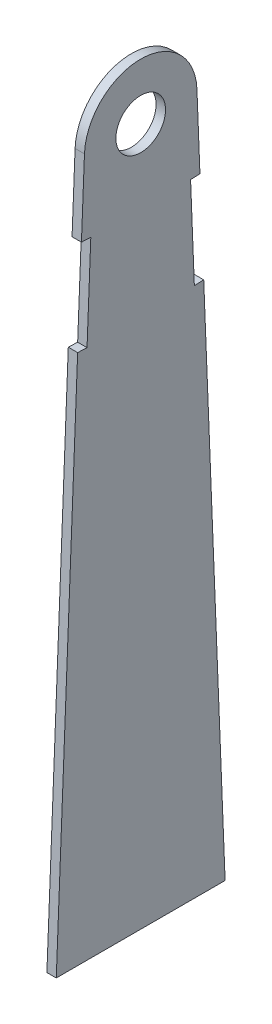
ISO-10303-21;
HEADER;
FILE_DESCRIPTION(('STEP AP214'),'2;1');
FILE_NAME('part.step','',(''),(''),'','','');
FILE_SCHEMA(('AUTOMOTIVE_DESIGN { 1 0 10303 214 1 1 1 1 }'));
ENDSEC;
DATA;
#1=APPLICATION_CONTEXT('core data for automotive mechanical design processes');
#2=APPLICATION_PROTOCOL_DEFINITION('international standard','automotive_design',2000,#1);
#3=PRODUCT_CONTEXT('',#1,'mechanical');
#4=PRODUCT('Part','Part','',(#3));
#5=PRODUCT_RELATED_PRODUCT_CATEGORY('part','',(#4));
#6=PRODUCT_DEFINITION_FORMATION('','',#4);
#7=PRODUCT_DEFINITION_CONTEXT('part definition',#1,'design');
#8=PRODUCT_DEFINITION('design','',#6,#7);
#9=PRODUCT_DEFINITION_SHAPE('','',#8);
#10=(LENGTH_UNIT() NAMED_UNIT(*) SI_UNIT(.MILLI.,.METRE.));
#11=(NAMED_UNIT(*) PLANE_ANGLE_UNIT() SI_UNIT($,.RADIAN.));
#12=(NAMED_UNIT(*) SI_UNIT($,.STERADIAN.) SOLID_ANGLE_UNIT());
#13=UNCERTAINTY_MEASURE_WITH_UNIT(LENGTH_MEASURE(1.E-05),#10,'distance_accuracy_value','');
#14=(GEOMETRIC_REPRESENTATION_CONTEXT(3) GLOBAL_UNCERTAINTY_ASSIGNED_CONTEXT((#13)) GLOBAL_UNIT_ASSIGNED_CONTEXT((#10,
#11,#12)) REPRESENTATION_CONTEXT('',''));
#15=CARTESIAN_POINT('',(0.,0.,0.));
#16=DIRECTION('',(0.,0.,1.));
#17=DIRECTION('',(1.,0.,0.));
#18=AXIS2_PLACEMENT_3D('',#15,#16,#17);
#19=CARTESIAN_POINT('',(1.5875,0.38341424361724,-9.51727999576515));
#20=DIRECTION('',(0.,-0.0402534638968231,0.999189500867732));
#21=DIRECTION('',(0.,-0.999189500867732,-0.0402534638968231));
#22=AXIS2_PLACEMENT_3D('',#19,#20,#21);
#23=PLANE('',#22);
#24=DIRECTION('',(0.,0.999189500867732,0.0402534638968231));
#25=VECTOR('',#24,1.);
#26=CARTESIAN_POINT('',(0.,0.38341424361724,-9.51727999576515));
#27=LINE('',#26,#25);
#28=CARTESIAN_POINT('',(0.,-12.306292417403,-10.0284989872548));
#29=VERTEX_POINT('',#28);
#30=CARTESIAN_POINT('',(0.,0.38341424361724,-9.51727999576515));
#31=VERTEX_POINT('',#30);
#32=EDGE_CURVE('E157',#29,#31,#27,.T.);
#33=ORIENTED_EDGE('',*,*,#32,.T.);
#34=DIRECTION('',(-1.,0.,0.));
#35=VECTOR('',#34,1.);
#36=CARTESIAN_POINT('',(1.5875,0.38341424361724,-9.51727999576515));
#37=LINE('',#36,#35);
#38=CARTESIAN_POINT('',(1.5875,0.38341424361724,-9.51727999576515));
#39=VERTEX_POINT('',#38);
#40=EDGE_CURVE('E11',#39,#31,#37,.T.);
#41=ORIENTED_EDGE('',*,*,#40,.F.);
#42=DIRECTION('',(0.,0.999189500867732,0.0402534638968231));
#43=VECTOR('',#42,1.);
#44=CARTESIAN_POINT('',(1.5875,0.38341424361724,-9.51727999576515));
#45=LINE('',#44,#43);
#46=CARTESIAN_POINT('',(1.5875,-12.306292417403,-10.0284989872548));
#47=VERTEX_POINT('',#46);
#48=EDGE_CURVE('E186',#47,#39,#45,.T.);
#49=ORIENTED_EDGE('',*,*,#48,.F.);
#50=DIRECTION('',(-1.,0.,0.));
#51=VECTOR('',#50,1.);
#52=CARTESIAN_POINT('',(1.5875,-12.306292417403,-10.0284989872548));
#53=LINE('',#52,#51);
#54=EDGE_CURVE('E51',#47,#29,#53,.T.);
#55=ORIENTED_EDGE('',*,*,#54,.T.);
#56=EDGE_LOOP('',(#33,#41,#49,#55));
#57=FACE_BOUND('',#56,.T.);
#58=ADVANCED_FACE('F34',(#57),#23,.F.);
#59=CARTESIAN_POINT('',(1.5875,0.,0.));
#60=DIRECTION('',(-1.,0.,0.));
#61=DIRECTION('',(0.,0.,1.));
#62=AXIS2_PLACEMENT_3D('',#59,#60,#61);
#63=CYLINDRICAL_SURFACE('',#62,9.525);
#64=CARTESIAN_POINT('',(0.,0.,0.));
#65=DIRECTION('',(1.,0.,0.));
#66=DIRECTION('',(0.,0.,-1.));
#67=AXIS2_PLACEMENT_3D('',#64,#65,#66);
#68=CIRCLE('',#67,9.525);
#69=CARTESIAN_POINT('',(0.,0.383414243617209,9.51727999576515));
#70=VERTEX_POINT('',#69);
#71=EDGE_CURVE('E159',#31,#70,#68,.T.);
#72=ORIENTED_EDGE('',*,*,#71,.T.);
#73=DIRECTION('',(-1.,0.,0.));
#74=VECTOR('',#73,1.);
#75=CARTESIAN_POINT('',(1.5875,0.383414243617209,9.51727999576515));
#76=LINE('',#75,#74);
#77=CARTESIAN_POINT('',(1.5875,0.383414243617209,9.51727999576515));
#78=VERTEX_POINT('',#77);
#79=EDGE_CURVE('E43',#78,#70,#76,.T.);
#80=ORIENTED_EDGE('',*,*,#79,.F.);
#81=CARTESIAN_POINT('',(1.5875,0.,0.));
#82=DIRECTION('',(1.,0.,0.));
#83=DIRECTION('',(0.,0.,-1.));
#84=AXIS2_PLACEMENT_3D('',#81,#82,#83);
#85=CIRCLE('',#84,9.525);
#86=EDGE_CURVE('E102',#39,#78,#85,.T.);
#87=ORIENTED_EDGE('',*,*,#86,.F.);
#88=ORIENTED_EDGE('',*,*,#40,.T.);
#89=EDGE_LOOP('',(#72,#80,#87,#88));
#90=FACE_BOUND('',#89,.T.);
#91=ADVANCED_FACE('F36',(#90),#63,.T.);
#92=CARTESIAN_POINT('',(1.5875,0.383414243617209,9.51727999576515));
#93=DIRECTION('',(0.,0.0402534638968198,0.999189500867732));
#94=DIRECTION('',(0.,-0.999189500867732,0.0402534638968198));
#95=AXIS2_PLACEMENT_3D('',#92,#93,#94);
#96=PLANE('',#95);
#97=DIRECTION('',(0.,0.999189500867732,-0.0402534638968198));
#98=VECTOR('',#97,1.);
#99=CARTESIAN_POINT('',(0.,0.383414243617209,9.51727999576515));
#100=LINE('',#99,#98);
#101=CARTESIAN_POINT('',(0.,-12.306292417403,10.0284989872548));
#102=VERTEX_POINT('',#101);
#103=EDGE_CURVE('E164',#102,#70,#100,.T.);
#104=ORIENTED_EDGE('',*,*,#103,.F.);
#105=DIRECTION('',(-1.,0.,0.));
#106=VECTOR('',#105,1.);
#107=CARTESIAN_POINT('',(1.5875,-12.306292417403,10.0284989872548));
#108=LINE('',#107,#106);
#109=CARTESIAN_POINT('',(1.5875,-12.306292417403,10.0284989872548));
#110=VERTEX_POINT('',#109);
#111=EDGE_CURVE('E200',#110,#102,#108,.T.);
#112=ORIENTED_EDGE('',*,*,#111,.F.);
#113=DIRECTION('',(0.,0.999189500867732,-0.0402534638968198));
#114=VECTOR('',#113,1.);
#115=CARTESIAN_POINT('',(1.5875,0.383414243617209,9.51727999576515));
#116=LINE('',#115,#114);
#117=EDGE_CURVE('E206',#110,#78,#116,.T.);
#118=ORIENTED_EDGE('',*,*,#117,.T.);
#119=ORIENTED_EDGE('',*,*,#79,.T.);
#120=EDGE_LOOP('',(#104,#112,#118,#119));
#121=FACE_BOUND('',#120,.T.);
#122=ADVANCED_FACE('F204',(#121),#96,.T.);
#123=CARTESIAN_POINT('',(1.5875,-12.6897066610202,0.511218991489607));
#124=DIRECTION('',(0.,0.999189500867732,-0.0402534638968195));
#125=DIRECTION('',(0.,0.0402534638968195,0.999189500867732));
#126=AXIS2_PLACEMENT_3D('',#123,#124,#125);
#127=PLANE('',#126);
#128=DIRECTION('',(0.,-0.0402534638968195,-0.999189500867732));
#129=VECTOR('',#128,1.);
#130=CARTESIAN_POINT('',(0.,-12.6897066610202,0.511218991489607));
#131=LINE('',#130,#129);
#132=CARTESIAN_POINT('',(0.,-12.3701947913392,8.44228565462724));
#133=VERTEX_POINT('',#132);
#134=EDGE_CURVE('E167',#102,#133,#131,.T.);
#135=ORIENTED_EDGE('',*,*,#134,.T.);
#136=DIRECTION('',(-1.,0.,0.));
#137=VECTOR('',#136,1.);
#138=CARTESIAN_POINT('',(1.5875,-12.3701947913392,8.44228565462724));
#139=LINE('',#138,#137);
#140=CARTESIAN_POINT('',(1.5875,-12.3701947913392,8.44228565462724));
#141=VERTEX_POINT('',#140);
#142=EDGE_CURVE('E198',#141,#133,#139,.T.);
#143=ORIENTED_EDGE('',*,*,#142,.F.);
#144=DIRECTION('',(0.,-0.0402534638968195,-0.999189500867732));
#145=VECTOR('',#144,1.);
#146=CARTESIAN_POINT('',(1.5875,-12.6897066610202,0.511218991489607));
#147=LINE('',#146,#145);
#148=EDGE_CURVE('E217',#110,#141,#147,.T.);
#149=ORIENTED_EDGE('',*,*,#148,.F.);
#150=ORIENTED_EDGE('',*,*,#111,.T.);
#151=EDGE_LOOP('',(#135,#143,#149,#150));
#152=FACE_BOUND('',#151,.T.);
#153=ADVANCED_FACE('F214',(#152),#127,.F.);
#154=CARTESIAN_POINT('',(1.5875,0.319511869681007,7.93106666313763));
#155=DIRECTION('',(0.,0.0402534638968198,0.999189500867732));
#156=DIRECTION('',(0.,-0.999189500867732,0.0402534638968198));
#157=AXIS2_PLACEMENT_3D('',#154,#155,#156);
#158=PLANE('',#157);
#159=DIRECTION('',(0.,0.999189500867732,-0.0402534638968198));
#160=VECTOR('',#159,1.);
#161=CARTESIAN_POINT('',(0.,0.319511869681007,7.93106666313763));
#162=LINE('',#161,#160);
#163=CARTESIAN_POINT('',(0.,-28.2323281176144,9.08130939398925));
#164=VERTEX_POINT('',#163);
#165=EDGE_CURVE('E171',#164,#133,#162,.T.);
#166=ORIENTED_EDGE('',*,*,#165,.F.);
#167=DIRECTION('',(-1.,0.,0.));
#168=VECTOR('',#167,1.);
#169=CARTESIAN_POINT('',(1.5875,-28.2323281176144,9.08130939398925));
#170=LINE('',#169,#168);
#171=CARTESIAN_POINT('',(1.5875,-28.2323281176144,9.08130939398925));
#172=VERTEX_POINT('',#171);
#173=EDGE_CURVE('E196',#172,#164,#170,.T.);
#174=ORIENTED_EDGE('',*,*,#173,.F.);
#175=DIRECTION('',(0.,0.999189500867732,-0.0402534638968198));
#176=VECTOR('',#175,1.);
#177=CARTESIAN_POINT('',(1.5875,0.319511869681007,7.93106666313763));
#178=LINE('',#177,#176);
#179=EDGE_CURVE('E219',#172,#141,#178,.T.);
#180=ORIENTED_EDGE('',*,*,#179,.T.);
#181=ORIENTED_EDGE('',*,*,#142,.T.);
#182=EDGE_LOOP('',(#166,#174,#180,#181));
#183=FACE_BOUND('',#182,.T.);
#184=ADVANCED_FACE('F236',(#183),#158,.T.);
#185=CARTESIAN_POINT('',(1.5875,-28.5518399872954,1.15024273085158));
#186=DIRECTION('',(0.,0.999189500867732,-0.0402534638968183));
#187=DIRECTION('',(0.,0.0402534638968183,0.999189500867732));
#188=AXIS2_PLACEMENT_3D('',#185,#186,#187);
#189=PLANE('',#188);
#190=DIRECTION('',(0.,-0.0402534638968183,-0.999189500867732));
#191=VECTOR('',#190,1.);
#192=CARTESIAN_POINT('',(0.,-28.5518399872954,1.15024273085158));
#193=LINE('',#192,#191);
#194=CARTESIAN_POINT('',(0.,-28.1684257436782,10.6675227266168));
#195=VERTEX_POINT('',#194);
#196=EDGE_CURVE('E174',#195,#164,#193,.T.);
#197=ORIENTED_EDGE('',*,*,#196,.F.);
#198=DIRECTION('',(-1.,0.,0.));
#199=VECTOR('',#198,1.);
#200=CARTESIAN_POINT('',(1.5875,-28.1684257436782,10.6675227266168));
#201=LINE('',#200,#199);
#202=CARTESIAN_POINT('',(1.5875,-28.1684257436782,10.6675227266168));
#203=VERTEX_POINT('',#202);
#204=EDGE_CURVE('E194',#203,#195,#201,.T.);
#205=ORIENTED_EDGE('',*,*,#204,.F.);
#206=DIRECTION('',(0.,-0.0402534638968183,-0.999189500867732));
#207=VECTOR('',#206,1.);
#208=CARTESIAN_POINT('',(1.5875,-28.5518399872954,1.15024273085158));
#209=LINE('',#208,#207);
#210=EDGE_CURVE('E226',#203,#172,#209,.T.);
#211=ORIENTED_EDGE('',*,*,#210,.T.);
#212=ORIENTED_EDGE('',*,*,#173,.T.);
#213=EDGE_LOOP('',(#197,#205,#211,#212));
#214=FACE_BOUND('',#213,.T.);
#215=ADVANCED_FACE('F273',(#214),#189,.T.);
#216=CARTESIAN_POINT('',(0.,-118.025122156577,14.2874999999998));
#217=VERTEX_POINT('',#216);
#218=EDGE_CURVE('E168',#217,#195,#100,.T.);
#219=ORIENTED_EDGE('',*,*,#218,.F.);
#220=DIRECTION('',(-1.,0.,0.));
#221=VECTOR('',#220,1.);
#222=CARTESIAN_POINT('',(1.5875,-118.025122156577,14.2874999999998));
#223=LINE('',#222,#221);
#224=CARTESIAN_POINT('',(1.5875,-118.025122156577,14.2874999999998));
#225=VERTEX_POINT('',#224);
#226=EDGE_CURVE('E192',#225,#217,#223,.T.);
#227=ORIENTED_EDGE('',*,*,#226,.F.);
#228=EDGE_CURVE('E222',#225,#203,#116,.T.);
#229=ORIENTED_EDGE('',*,*,#228,.T.);
#230=ORIENTED_EDGE('',*,*,#204,.T.);
#231=EDGE_LOOP('',(#219,#227,#229,#230));
#232=FACE_BOUND('',#231,.T.);
#233=ADVANCED_FACE('F269',(#232),#96,.T.);
#234=CARTESIAN_POINT('',(1.5875,-118.025122156577,0.));
#235=DIRECTION('',(0.,-1.,0.));
#236=DIRECTION('',(0.,0.,-1.));
#237=AXIS2_PLACEMENT_3D('',#234,#235,#236);
#238=PLANE('',#237);
#239=DIRECTION('',(0.,0.,1.));
#240=VECTOR('',#239,1.);
#241=CARTESIAN_POINT('',(0.,-118.025122156577,0.));
#242=LINE('',#241,#240);
#243=CARTESIAN_POINT('',(0.,-118.025122156577,-14.2875000000002));
#244=VERTEX_POINT('',#243);
#245=EDGE_CURVE('E177',#244,#217,#242,.T.);
#246=ORIENTED_EDGE('',*,*,#245,.F.);
#247=DIRECTION('',(-1.,0.,0.));
#248=VECTOR('',#247,1.);
#249=CARTESIAN_POINT('',(1.5875,-118.025122156577,-14.2875000000002));
#250=LINE('',#249,#248);
#251=CARTESIAN_POINT('',(1.5875,-118.025122156577,-14.2875000000002));
#252=VERTEX_POINT('',#251);
#253=EDGE_CURVE('E190',#252,#244,#250,.T.);
#254=ORIENTED_EDGE('',*,*,#253,.F.);
#255=DIRECTION('',(0.,0.,1.));
#256=VECTOR('',#255,1.);
#257=CARTESIAN_POINT('',(1.5875,-118.025122156577,0.));
#258=LINE('',#257,#256);
#259=EDGE_CURVE('E225',#252,#225,#258,.T.);
#260=ORIENTED_EDGE('',*,*,#259,.T.);
#261=ORIENTED_EDGE('',*,*,#226,.T.);
#262=EDGE_LOOP('',(#246,#254,#260,#261));
#263=FACE_BOUND('',#262,.T.);
#264=ADVANCED_FACE('F239',(#263),#238,.T.);
#265=CARTESIAN_POINT('',(0.,-28.1684257436782,-10.6675227266169));
#266=VERTEX_POINT('',#265);
#267=EDGE_CURVE('E161',#244,#266,#27,.T.);
#268=ORIENTED_EDGE('',*,*,#267,.T.);
#269=DIRECTION('',(-1.,0.,0.));
#270=VECTOR('',#269,1.);
#271=CARTESIAN_POINT('',(1.5875,-28.1684257436782,-10.6675227266169));
#272=LINE('',#271,#270);
#273=CARTESIAN_POINT('',(1.5875,-28.1684257436782,-10.6675227266169));
#274=VERTEX_POINT('',#273);
#275=EDGE_CURVE('E149',#274,#266,#272,.T.);
#276=ORIENTED_EDGE('',*,*,#275,.F.);
#277=EDGE_CURVE('E137',#252,#274,#45,.T.);
#278=ORIENTED_EDGE('',*,*,#277,.F.);
#279=ORIENTED_EDGE('',*,*,#253,.T.);
#280=EDGE_LOOP('',(#268,#276,#278,#279));
#281=FACE_BOUND('',#280,.T.);
#282=ADVANCED_FACE('F243',(#281),#23,.F.);
#283=CARTESIAN_POINT('',(1.5875,-28.5518399872954,-1.15024273085177));
#284=DIRECTION('',(0.,-0.999189500867732,-0.0402534638968248));
#285=DIRECTION('',(0.,0.0402534638968248,-0.999189500867732));
#286=AXIS2_PLACEMENT_3D('',#283,#284,#285);
#287=PLANE('',#286);
#288=DIRECTION('',(0.,-0.0402534638968248,0.999189500867732));
#289=VECTOR('',#288,1.);
#290=CARTESIAN_POINT('',(0.,-28.5518399872954,-1.15024273085177));
#291=LINE('',#290,#289);
#292=CARTESIAN_POINT('',(0.,-28.2323281176144,-9.08130939398934));
#293=VERTEX_POINT('',#292);
#294=EDGE_CURVE('E146',#266,#293,#291,.T.);
#295=ORIENTED_EDGE('',*,*,#294,.T.);
#296=DIRECTION('',(-1.,0.,0.));
#297=VECTOR('',#296,1.);
#298=CARTESIAN_POINT('',(1.5875,-28.2323281176144,-9.08130939398934));
#299=LINE('',#298,#297);
#300=CARTESIAN_POINT('',(1.5875,-28.2323281176144,-9.08130939398934));
#301=VERTEX_POINT('',#300);
#302=EDGE_CURVE('E143',#301,#293,#299,.T.);
#303=ORIENTED_EDGE('',*,*,#302,.F.);
#304=DIRECTION('',(0.,-0.0402534638968248,0.999189500867732));
#305=VECTOR('',#304,1.);
#306=CARTESIAN_POINT('',(1.5875,-28.5518399872954,-1.15024273085177));
#307=LINE('',#306,#305);
#308=EDGE_CURVE('E129',#274,#301,#307,.T.);
#309=ORIENTED_EDGE('',*,*,#308,.F.);
#310=ORIENTED_EDGE('',*,*,#275,.T.);
#311=EDGE_LOOP('',(#295,#303,#309,#310));
#312=FACE_BOUND('',#311,.T.);
#313=ADVANCED_FACE('F144',(#312),#287,.F.);
#314=CARTESIAN_POINT('',(1.5875,0.319511869681033,-7.93106666313762));
#315=DIRECTION('',(0.,-0.040253463896823,0.999189500867732));
#316=DIRECTION('',(0.,-0.999189500867732,-0.040253463896823));
#317=AXIS2_PLACEMENT_3D('',#314,#315,#316);
#318=PLANE('',#317);
#319=DIRECTION('',(0.,0.999189500867732,0.040253463896823));
#320=VECTOR('',#319,1.);
#321=CARTESIAN_POINT('',(0.,0.319511869681033,-7.93106666313762));
#322=LINE('',#321,#320);
#323=CARTESIAN_POINT('',(0.,-12.3701947913392,-8.44228565462727));
#324=VERTEX_POINT('',#323);
#325=EDGE_CURVE('E181',#293,#324,#322,.T.);
#326=ORIENTED_EDGE('',*,*,#325,.T.);
#327=DIRECTION('',(-1.,0.,0.));
#328=VECTOR('',#327,1.);
#329=CARTESIAN_POINT('',(1.5875,-12.3701947913392,-8.44228565462727));
#330=LINE('',#329,#328);
#331=CARTESIAN_POINT('',(1.5875,-12.3701947913392,-8.44228565462727));
#332=VERTEX_POINT('',#331);
#333=EDGE_CURVE('E90',#332,#324,#330,.T.);
#334=ORIENTED_EDGE('',*,*,#333,.F.);
#335=DIRECTION('',(0.,0.999189500867732,0.040253463896823));
#336=VECTOR('',#335,1.);
#337=CARTESIAN_POINT('',(1.5875,0.319511869681033,-7.93106666313762));
#338=LINE('',#337,#336);
#339=EDGE_CURVE('E134',#301,#332,#338,.T.);
#340=ORIENTED_EDGE('',*,*,#339,.F.);
#341=ORIENTED_EDGE('',*,*,#302,.T.);
#342=EDGE_LOOP('',(#326,#334,#340,#341));
#343=FACE_BOUND('',#342,.T.);
#344=ADVANCED_FACE('F151',(#343),#318,.F.);
#345=CARTESIAN_POINT('',(1.5875,-12.6897066610202,-0.51121899148959));
#346=DIRECTION('',(0.,-0.999189500867732,-0.0402534638968183));
#347=DIRECTION('',(0.,0.0402534638968183,-0.999189500867732));
#348=AXIS2_PLACEMENT_3D('',#345,#346,#347);
#349=PLANE('',#348);
#350=DIRECTION('',(0.,-0.0402534638968183,0.999189500867732));
#351=VECTOR('',#350,1.);
#352=CARTESIAN_POINT('',(0.,-12.6897066610202,-0.51121899148959));
#353=LINE('',#352,#351);
#354=EDGE_CURVE('E183',#29,#324,#353,.T.);
#355=ORIENTED_EDGE('',*,*,#354,.F.);
#356=ORIENTED_EDGE('',*,*,#54,.F.);
#357=DIRECTION('',(0.,-0.0402534638968183,0.999189500867732));
#358=VECTOR('',#357,1.);
#359=CARTESIAN_POINT('',(1.5875,-12.6897066610202,-0.51121899148959));
#360=LINE('',#359,#358);
#361=EDGE_CURVE('E152',#47,#332,#360,.T.);
#362=ORIENTED_EDGE('',*,*,#361,.T.);
#363=ORIENTED_EDGE('',*,*,#333,.T.);
#364=EDGE_LOOP('',(#355,#356,#362,#363));
#365=FACE_BOUND('',#364,.T.);
#366=ADVANCED_FACE('F246',(#365),#349,.T.);
#367=CARTESIAN_POINT('',(1.5875,0.,0.));
#368=DIRECTION('',(1.,0.,0.));
#369=DIRECTION('',(0.,0.,-1.));
#370=AXIS2_PLACEMENT_3D('',#367,#368,#369);
#371=PLANE('',#370);
#372=CARTESIAN_POINT('',(1.5875,0.,0.));
#373=DIRECTION('',(1.,0.,0.));
#374=DIRECTION('',(0.,0.,-1.));
#375=AXIS2_PLACEMENT_3D('',#372,#373,#374);
#376=CIRCLE('',#375,4.2);
#377=CARTESIAN_POINT('',(1.5875,0.,-4.2));
#378=VERTEX_POINT('',#377);
#379=EDGE_CURVE('E372',#378,#378,#376,.T.);
#380=ORIENTED_EDGE('',*,*,#379,.F.);
#381=EDGE_LOOP('',(#380));
#382=FACE_BOUND('',#381,.T.);
#383=ORIENTED_EDGE('',*,*,#48,.T.);
#384=ORIENTED_EDGE('',*,*,#86,.T.);
#385=ORIENTED_EDGE('',*,*,#117,.F.);
#386=ORIENTED_EDGE('',*,*,#148,.T.);
#387=ORIENTED_EDGE('',*,*,#179,.F.);
#388=ORIENTED_EDGE('',*,*,#210,.F.);
#389=ORIENTED_EDGE('',*,*,#228,.F.);
#390=ORIENTED_EDGE('',*,*,#259,.F.);
#391=ORIENTED_EDGE('',*,*,#277,.T.);
#392=ORIENTED_EDGE('',*,*,#308,.T.);
#393=ORIENTED_EDGE('',*,*,#339,.T.);
#394=ORIENTED_EDGE('',*,*,#361,.F.);
#395=EDGE_LOOP('',(#383,#384,#385,#386,#387,#388,#389,#390,#391,#392,#393,#394));
#396=FACE_BOUND('',#395,.T.);
#397=ADVANCED_FACE('F131',(#382,#396),#371,.T.);
#398=CARTESIAN_POINT('',(0.,0.,0.));
#399=DIRECTION('',(1.,0.,0.));
#400=DIRECTION('',(0.,0.,-1.));
#401=AXIS2_PLACEMENT_3D('',#398,#399,#400);
#402=PLANE('',#401);
#403=CARTESIAN_POINT('',(0.,0.,0.));
#404=DIRECTION('',(1.,0.,0.));
#405=DIRECTION('',(0.,0.,-1.));
#406=AXIS2_PLACEMENT_3D('',#403,#404,#405);
#407=CIRCLE('',#406,4.2);
#408=CARTESIAN_POINT('',(0.,0.,-4.2));
#409=VERTEX_POINT('',#408);
#410=EDGE_CURVE('E160',#409,#409,#407,.T.);
#411=ORIENTED_EDGE('',*,*,#410,.T.);
#412=EDGE_LOOP('',(#411));
#413=FACE_BOUND('',#412,.T.);
#414=ORIENTED_EDGE('',*,*,#32,.F.);
#415=ORIENTED_EDGE('',*,*,#354,.T.);
#416=ORIENTED_EDGE('',*,*,#325,.F.);
#417=ORIENTED_EDGE('',*,*,#294,.F.);
#418=ORIENTED_EDGE('',*,*,#267,.F.);
#419=ORIENTED_EDGE('',*,*,#245,.T.);
#420=ORIENTED_EDGE('',*,*,#218,.T.);
#421=ORIENTED_EDGE('',*,*,#196,.T.);
#422=ORIENTED_EDGE('',*,*,#165,.T.);
#423=ORIENTED_EDGE('',*,*,#134,.F.);
#424=ORIENTED_EDGE('',*,*,#103,.T.);
#425=ORIENTED_EDGE('',*,*,#71,.F.);
#426=EDGE_LOOP('',(#414,#415,#416,#417,#418,#419,#420,#421,#422,#423,#424,#425));
#427=FACE_BOUND('',#426,.T.);
#428=ADVANCED_FACE('F210',(#413,#427),#402,.F.);
#429=CARTESIAN_POINT('',(1.5875,0.,0.));
#430=DIRECTION('',(1.,0.,0.));
#431=DIRECTION('',(0.,0.,-1.));
#432=AXIS2_PLACEMENT_3D('',#429,#430,#431);
#433=CYLINDRICAL_SURFACE('',#432,4.2);
#434=ORIENTED_EDGE('',*,*,#410,.F.);
#435=EDGE_LOOP('',(#434));
#436=FACE_BOUND('',#435,.T.);
#437=ORIENTED_EDGE('',*,*,#379,.T.);
#438=EDGE_LOOP('',(#437));
#439=FACE_BOUND('',#438,.T.);
#440=ADVANCED_FACE('F354',(#436,#439),#433,.F.);
#441=CLOSED_SHELL('',(#58,#91,#122,#153,#184,#215,#233,#264,#282,#313,#344,#366,#397,#428,#440));
#442=MANIFOLD_SOLID_BREP('B2',#441);
#443=ADVANCED_BREP_SHAPE_REPRESENTATION('',(#18,#442),#14);
#444=SHAPE_DEFINITION_REPRESENTATION(#9,#443);
ENDSEC;
END-ISO-10303-21;
